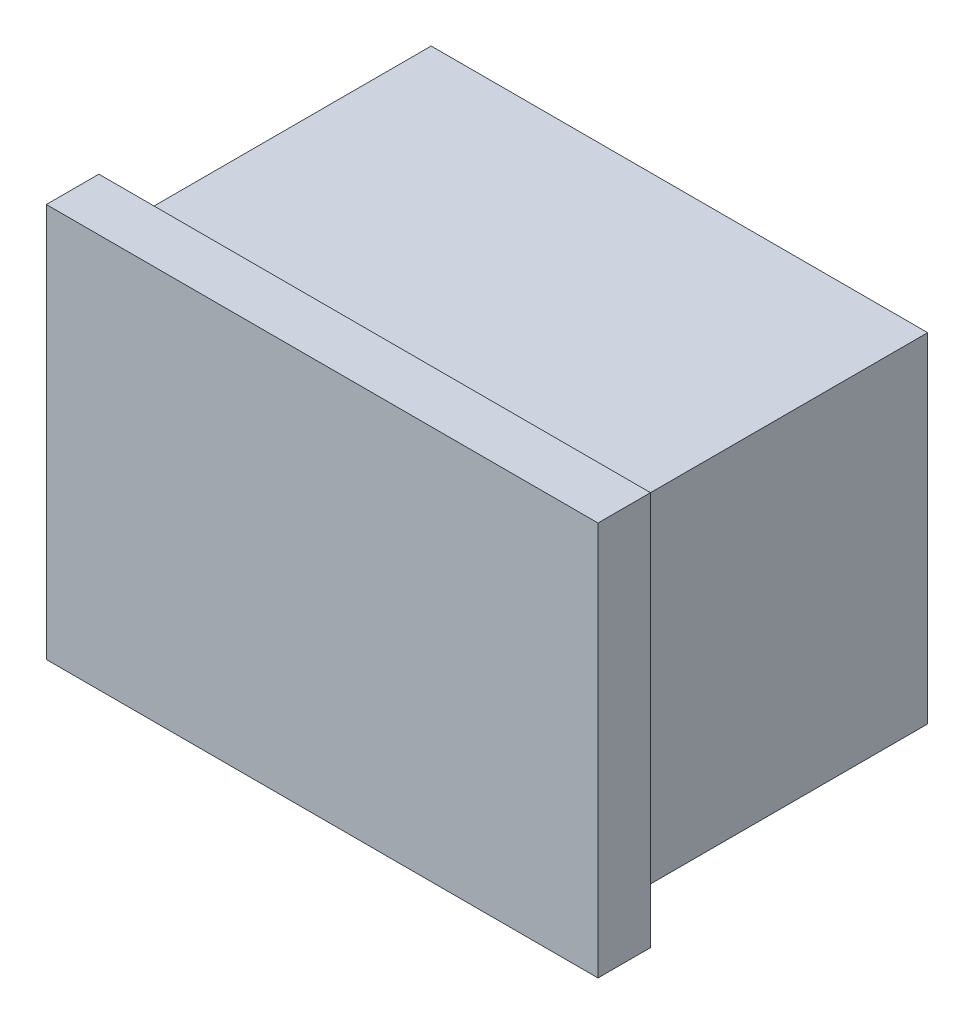
ISO-10303-21;
HEADER;
FILE_DESCRIPTION(('STEP AP214'),'2;1');
FILE_NAME('part.step','',(''),(''),'','','');
FILE_SCHEMA(('AUTOMOTIVE_DESIGN { 1 0 10303 214 1 1 1 1 }'));
ENDSEC;
DATA;
#1=APPLICATION_CONTEXT('core data for automotive mechanical design processes');
#2=APPLICATION_PROTOCOL_DEFINITION('international standard','automotive_design',2000,#1);
#3=PRODUCT_CONTEXT('',#1,'mechanical');
#4=PRODUCT('Part','Part','',(#3));
#5=PRODUCT_RELATED_PRODUCT_CATEGORY('part','',(#4));
#6=PRODUCT_DEFINITION_FORMATION('','',#4);
#7=PRODUCT_DEFINITION_CONTEXT('part definition',#1,'design');
#8=PRODUCT_DEFINITION('design','',#6,#7);
#9=PRODUCT_DEFINITION_SHAPE('','',#8);
#10=(LENGTH_UNIT() NAMED_UNIT(*) SI_UNIT(.MILLI.,.METRE.));
#11=(NAMED_UNIT(*) PLANE_ANGLE_UNIT() SI_UNIT($,.RADIAN.));
#12=(NAMED_UNIT(*) SI_UNIT($,.STERADIAN.) SOLID_ANGLE_UNIT());
#13=UNCERTAINTY_MEASURE_WITH_UNIT(LENGTH_MEASURE(1.E-05),#10,'distance_accuracy_value','');
#14=(GEOMETRIC_REPRESENTATION_CONTEXT(3) GLOBAL_UNCERTAINTY_ASSIGNED_CONTEXT((#13)) GLOBAL_UNIT_ASSIGNED_CONTEXT((#10,
#11,#12)) REPRESENTATION_CONTEXT('',''));
#15=CARTESIAN_POINT('',(0.,0.,0.));
#16=DIRECTION('',(0.,0.,1.));
#17=DIRECTION('',(1.,0.,0.));
#18=AXIS2_PLACEMENT_3D('',#15,#16,#17);
#19=CARTESIAN_POINT('',(0.,0.,11.6));
#20=DIRECTION('',(1.,0.,0.));
#21=DIRECTION('',(0.,0.,-1.));
#22=AXIS2_PLACEMENT_3D('',#19,#20,#21);
#23=PLANE('',#22);
#24=DIRECTION('',(0.,-1.,0.));
#25=VECTOR('',#24,1.);
#26=CARTESIAN_POINT('',(0.,0.,0.));
#27=LINE('',#26,#25);
#28=CARTESIAN_POINT('',(0.,12.9,0.));
#29=VERTEX_POINT('',#28);
#30=CARTESIAN_POINT('',(0.,0.,0.));
#31=VERTEX_POINT('',#30);
#32=EDGE_CURVE('E131',#29,#31,#27,.T.);
#33=ORIENTED_EDGE('',*,*,#32,.T.);
#34=DIRECTION('',(0.,0.,-1.));
#35=VECTOR('',#34,1.);
#36=CARTESIAN_POINT('',(0.,0.,11.6));
#37=LINE('',#36,#35);
#38=CARTESIAN_POINT('',(0.,0.,11.6));
#39=VERTEX_POINT('',#38);
#40=EDGE_CURVE('E11',#39,#31,#37,.T.);
#41=ORIENTED_EDGE('',*,*,#40,.F.);
#42=DIRECTION('',(0.,-1.,0.));
#43=VECTOR('',#42,1.);
#44=CARTESIAN_POINT('',(0.,0.,11.6));
#45=LINE('',#44,#43);
#46=CARTESIAN_POINT('',(0.,12.9,11.6));
#47=VERTEX_POINT('',#46);
#48=EDGE_CURVE('E140',#47,#39,#45,.T.);
#49=ORIENTED_EDGE('',*,*,#48,.F.);
#50=DIRECTION('',(0.,0.,-1.));
#51=VECTOR('',#50,1.);
#52=CARTESIAN_POINT('',(0.,12.9,11.6));
#53=LINE('',#52,#51);
#54=EDGE_CURVE('E149',#47,#29,#53,.T.);
#55=ORIENTED_EDGE('',*,*,#54,.T.);
#56=EDGE_LOOP('',(#33,#41,#49,#55));
#57=FACE_BOUND('',#56,.T.);
#58=ADVANCED_FACE('F33',(#57),#23,.F.);
#59=CARTESIAN_POINT('',(0.,0.,11.6));
#60=DIRECTION('',(0.,1.,0.));
#61=DIRECTION('',(0.,0.,1.));
#62=AXIS2_PLACEMENT_3D('',#59,#60,#61);
#63=PLANE('',#62);
#64=DIRECTION('',(1.,0.,0.));
#65=VECTOR('',#64,1.);
#66=CARTESIAN_POINT('',(0.,0.,0.));
#67=LINE('',#66,#65);
#68=CARTESIAN_POINT('',(18.9,0.,0.));
#69=VERTEX_POINT('',#68);
#70=EDGE_CURVE('E134',#31,#69,#67,.T.);
#71=ORIENTED_EDGE('',*,*,#70,.T.);
#72=DIRECTION('',(0.,0.,-1.));
#73=VECTOR('',#72,1.);
#74=CARTESIAN_POINT('',(18.9,0.,11.6));
#75=LINE('',#74,#73);
#76=CARTESIAN_POINT('',(18.9,0.,11.6));
#77=VERTEX_POINT('',#76);
#78=EDGE_CURVE('E41',#77,#69,#75,.T.);
#79=ORIENTED_EDGE('',*,*,#78,.F.);
#80=DIRECTION('',(1.,0.,0.));
#81=VECTOR('',#80,1.);
#82=CARTESIAN_POINT('',(0.,0.,11.6));
#83=LINE('',#82,#81);
#84=EDGE_CURVE('E75',#39,#77,#83,.T.);
#85=ORIENTED_EDGE('',*,*,#84,.F.);
#86=ORIENTED_EDGE('',*,*,#40,.T.);
#87=EDGE_LOOP('',(#71,#79,#85,#86));
#88=FACE_BOUND('',#87,.T.);
#89=ADVANCED_FACE('F193',(#88),#63,.F.);
#90=CARTESIAN_POINT('',(18.9,0.,11.6));
#91=DIRECTION('',(-1.,0.,0.));
#92=DIRECTION('',(0.,0.,1.));
#93=AXIS2_PLACEMENT_3D('',#90,#91,#92);
#94=PLANE('',#93);
#95=DIRECTION('',(0.,1.,0.));
#96=VECTOR('',#95,1.);
#97=CARTESIAN_POINT('',(18.9,0.,0.));
#98=LINE('',#97,#96);
#99=CARTESIAN_POINT('',(18.9,12.9,0.));
#100=VERTEX_POINT('',#99);
#101=EDGE_CURVE('E65',#69,#100,#98,.T.);
#102=ORIENTED_EDGE('',*,*,#101,.T.);
#103=DIRECTION('',(0.,0.,-1.));
#104=VECTOR('',#103,1.);
#105=CARTESIAN_POINT('',(18.9,12.9,11.6));
#106=LINE('',#105,#104);
#107=CARTESIAN_POINT('',(18.9,12.9,11.6));
#108=VERTEX_POINT('',#107);
#109=EDGE_CURVE('E49',#108,#100,#106,.T.);
#110=ORIENTED_EDGE('',*,*,#109,.F.);
#111=DIRECTION('',(0.,1.,0.));
#112=VECTOR('',#111,1.);
#113=CARTESIAN_POINT('',(18.9,0.,11.6));
#114=LINE('',#113,#112);
#115=EDGE_CURVE('E144',#77,#108,#114,.T.);
#116=ORIENTED_EDGE('',*,*,#115,.F.);
#117=ORIENTED_EDGE('',*,*,#78,.T.);
#118=EDGE_LOOP('',(#102,#110,#116,#117));
#119=FACE_BOUND('',#118,.T.);
#120=ADVANCED_FACE('F155',(#119),#94,.F.);
#121=CARTESIAN_POINT('',(0.,12.9,11.6));
#122=DIRECTION('',(0.,-1.,0.));
#123=DIRECTION('',(0.,0.,-1.));
#124=AXIS2_PLACEMENT_3D('',#121,#122,#123);
#125=PLANE('',#124);
#126=DIRECTION('',(-1.,0.,0.));
#127=VECTOR('',#126,1.);
#128=CARTESIAN_POINT('',(0.,12.9,0.));
#129=LINE('',#128,#127);
#130=EDGE_CURVE('E70',#100,#29,#129,.T.);
#131=ORIENTED_EDGE('',*,*,#130,.T.);
#132=ORIENTED_EDGE('',*,*,#54,.F.);
#133=DIRECTION('',(-1.,0.,0.));
#134=VECTOR('',#133,1.);
#135=CARTESIAN_POINT('',(0.,12.9,11.6));
#136=LINE('',#135,#134);
#137=EDGE_CURVE('E147',#108,#47,#136,.T.);
#138=ORIENTED_EDGE('',*,*,#137,.F.);
#139=ORIENTED_EDGE('',*,*,#109,.T.);
#140=EDGE_LOOP('',(#131,#132,#138,#139));
#141=FACE_BOUND('',#140,.T.);
#142=ADVANCED_FACE('F160',(#141),#125,.F.);
#143=CARTESIAN_POINT('',(0.,0.,0.));
#144=DIRECTION('',(0.,0.,-1.));
#145=DIRECTION('',(-1.,0.,0.));
#146=AXIS2_PLACEMENT_3D('',#143,#144,#145);
#147=PLANE('',#146);
#148=ORIENTED_EDGE('',*,*,#32,.F.);
#149=ORIENTED_EDGE('',*,*,#130,.F.);
#150=ORIENTED_EDGE('',*,*,#101,.F.);
#151=ORIENTED_EDGE('',*,*,#70,.F.);
#152=EDGE_LOOP('',(#148,#149,#150,#151));
#153=FACE_BOUND('',#152,.T.);
#154=ADVANCED_FACE('F158',(#153),#147,.T.);
#155=CARTESIAN_POINT('',(19.95,13.95,13.6));
#156=DIRECTION('',(-1.,0.,0.));
#157=DIRECTION('',(0.,0.,1.));
#158=AXIS2_PLACEMENT_3D('',#155,#156,#157);
#159=PLANE('',#158);
#160=DIRECTION('',(0.,1.,0.));
#161=VECTOR('',#160,1.);
#162=CARTESIAN_POINT('',(19.95,13.95,11.6));
#163=LINE('',#162,#161);
#164=CARTESIAN_POINT('',(19.95,-1.05,11.6));
#165=VERTEX_POINT('',#164);
#166=CARTESIAN_POINT('',(19.95,13.95,11.6));
#167=VERTEX_POINT('',#166);
#168=EDGE_CURVE('E130',#165,#167,#163,.T.);
#169=ORIENTED_EDGE('',*,*,#168,.T.);
#170=DIRECTION('',(0.,0.,-1.));
#171=VECTOR('',#170,1.);
#172=CARTESIAN_POINT('',(19.95,13.95,13.6));
#173=LINE('',#172,#171);
#174=CARTESIAN_POINT('',(19.95,13.95,13.6));
#175=VERTEX_POINT('',#174);
#176=EDGE_CURVE('E110',#175,#167,#173,.T.);
#177=ORIENTED_EDGE('',*,*,#176,.F.);
#178=DIRECTION('',(0.,1.,0.));
#179=VECTOR('',#178,1.);
#180=CARTESIAN_POINT('',(19.95,13.95,13.6));
#181=LINE('',#180,#179);
#182=CARTESIAN_POINT('',(19.95,-1.05,13.6));
#183=VERTEX_POINT('',#182);
#184=EDGE_CURVE('E117',#183,#175,#181,.T.);
#185=ORIENTED_EDGE('',*,*,#184,.F.);
#186=DIRECTION('',(0.,0.,-1.));
#187=VECTOR('',#186,1.);
#188=CARTESIAN_POINT('',(19.95,-1.05,13.6));
#189=LINE('',#188,#187);
#190=EDGE_CURVE('E177',#183,#165,#189,.T.);
#191=ORIENTED_EDGE('',*,*,#190,.T.);
#192=EDGE_LOOP('',(#169,#177,#185,#191));
#193=FACE_BOUND('',#192,.T.);
#194=ADVANCED_FACE('F128',(#193),#159,.F.);
#195=CARTESIAN_POINT('',(19.95,13.95,13.6));
#196=DIRECTION('',(0.,-1.,0.));
#197=DIRECTION('',(0.,0.,-1.));
#198=AXIS2_PLACEMENT_3D('',#195,#196,#197);
#199=PLANE('',#198);
#200=DIRECTION('',(-1.,0.,0.));
#201=VECTOR('',#200,1.);
#202=CARTESIAN_POINT('',(19.95,13.95,11.6));
#203=LINE('',#202,#201);
#204=CARTESIAN_POINT('',(-1.05,13.95,11.6));
#205=VERTEX_POINT('',#204);
#206=EDGE_CURVE('E168',#167,#205,#203,.T.);
#207=ORIENTED_EDGE('',*,*,#206,.T.);
#208=DIRECTION('',(0.,0.,-1.));
#209=VECTOR('',#208,1.);
#210=CARTESIAN_POINT('',(-1.05,13.95,13.6));
#211=LINE('',#210,#209);
#212=CARTESIAN_POINT('',(-1.05,13.95,13.6));
#213=VERTEX_POINT('',#212);
#214=EDGE_CURVE('E113',#213,#205,#211,.T.);
#215=ORIENTED_EDGE('',*,*,#214,.F.);
#216=DIRECTION('',(-1.,0.,0.));
#217=VECTOR('',#216,1.);
#218=CARTESIAN_POINT('',(19.95,13.95,13.6));
#219=LINE('',#218,#217);
#220=EDGE_CURVE('E106',#175,#213,#219,.T.);
#221=ORIENTED_EDGE('',*,*,#220,.F.);
#222=ORIENTED_EDGE('',*,*,#176,.T.);
#223=EDGE_LOOP('',(#207,#215,#221,#222));
#224=FACE_BOUND('',#223,.T.);
#225=ADVANCED_FACE('F108',(#224),#199,.F.);
#226=CARTESIAN_POINT('',(-1.05,13.95,13.6));
#227=DIRECTION('',(1.,0.,0.));
#228=DIRECTION('',(0.,1.,0.));
#229=AXIS2_PLACEMENT_3D('',#226,#227,#228);
#230=PLANE('',#229);
#231=DIRECTION('',(0.,-1.,0.));
#232=VECTOR('',#231,1.);
#233=CARTESIAN_POINT('',(-1.05,13.95,11.6));
#234=LINE('',#233,#232);
#235=CARTESIAN_POINT('',(-1.05,-1.05,11.6));
#236=VERTEX_POINT('',#235);
#237=EDGE_CURVE('E170',#205,#236,#234,.T.);
#238=ORIENTED_EDGE('',*,*,#237,.T.);
#239=DIRECTION('',(0.,0.,-1.));
#240=VECTOR('',#239,1.);
#241=CARTESIAN_POINT('',(-1.05,-1.05,13.6));
#242=LINE('',#241,#240);
#243=CARTESIAN_POINT('',(-1.05,-1.05,13.6));
#244=VERTEX_POINT('',#243);
#245=EDGE_CURVE('E136',#244,#236,#242,.T.);
#246=ORIENTED_EDGE('',*,*,#245,.F.);
#247=DIRECTION('',(0.,-1.,0.));
#248=VECTOR('',#247,1.);
#249=CARTESIAN_POINT('',(-1.05,13.95,13.6));
#250=LINE('',#249,#248);
#251=EDGE_CURVE('E116',#213,#244,#250,.T.);
#252=ORIENTED_EDGE('',*,*,#251,.F.);
#253=ORIENTED_EDGE('',*,*,#214,.T.);
#254=EDGE_LOOP('',(#238,#246,#252,#253));
#255=FACE_BOUND('',#254,.T.);
#256=ADVANCED_FACE('F183',(#255),#230,.F.);
#257=CARTESIAN_POINT('',(19.95,-1.05,13.6));
#258=DIRECTION('',(0.,1.,0.));
#259=DIRECTION('',(-1.,0.,0.));
#260=AXIS2_PLACEMENT_3D('',#257,#258,#259);
#261=PLANE('',#260);
#262=DIRECTION('',(1.,0.,0.));
#263=VECTOR('',#262,1.);
#264=CARTESIAN_POINT('',(19.95,-1.05,11.6));
#265=LINE('',#264,#263);
#266=EDGE_CURVE('E126',#236,#165,#265,.T.);
#267=ORIENTED_EDGE('',*,*,#266,.T.);
#268=ORIENTED_EDGE('',*,*,#190,.F.);
#269=DIRECTION('',(1.,0.,0.));
#270=VECTOR('',#269,1.);
#271=CARTESIAN_POINT('',(19.95,-1.05,13.6));
#272=LINE('',#271,#270);
#273=EDGE_CURVE('E122',#244,#183,#272,.T.);
#274=ORIENTED_EDGE('',*,*,#273,.F.);
#275=ORIENTED_EDGE('',*,*,#245,.T.);
#276=EDGE_LOOP('',(#267,#268,#274,#275));
#277=FACE_BOUND('',#276,.T.);
#278=ADVANCED_FACE('F181',(#277),#261,.F.);
#279=CARTESIAN_POINT('',(0.,0.,13.6));
#280=DIRECTION('',(0.,0.,-1.));
#281=DIRECTION('',(-1.,0.,0.));
#282=AXIS2_PLACEMENT_3D('',#279,#280,#281);
#283=PLANE('',#282);
#284=ORIENTED_EDGE('',*,*,#184,.T.);
#285=ORIENTED_EDGE('',*,*,#220,.T.);
#286=ORIENTED_EDGE('',*,*,#251,.T.);
#287=ORIENTED_EDGE('',*,*,#273,.T.);
#288=EDGE_LOOP('',(#284,#285,#286,#287));
#289=FACE_BOUND('',#288,.T.);
#290=ADVANCED_FACE('F120',(#289),#283,.F.);
#291=CARTESIAN_POINT('',(0.,0.,11.6));
#292=DIRECTION('',(0.,0.,-1.));
#293=DIRECTION('',(-1.,0.,0.));
#294=AXIS2_PLACEMENT_3D('',#291,#292,#293);
#295=PLANE('',#294);
#296=ORIENTED_EDGE('',*,*,#137,.T.);
#297=ORIENTED_EDGE('',*,*,#48,.T.);
#298=ORIENTED_EDGE('',*,*,#84,.T.);
#299=ORIENTED_EDGE('',*,*,#115,.T.);
#300=EDGE_LOOP('',(#296,#297,#298,#299));
#301=FACE_BOUND('',#300,.T.);
#302=ORIENTED_EDGE('',*,*,#168,.F.);
#303=ORIENTED_EDGE('',*,*,#266,.F.);
#304=ORIENTED_EDGE('',*,*,#237,.F.);
#305=ORIENTED_EDGE('',*,*,#206,.F.);
#306=EDGE_LOOP('',(#302,#303,#304,#305));
#307=FACE_BOUND('',#306,.T.);
#308=ADVANCED_FACE('F162',(#301,#307),#295,.T.);
#309=CLOSED_SHELL('',(#58,#89,#120,#142,#154,#194,#225,#256,#278,#290,#308));
#310=MANIFOLD_SOLID_BREP('B2',#309);
#311=ADVANCED_BREP_SHAPE_REPRESENTATION('',(#18,#310),#14);
#312=SHAPE_DEFINITION_REPRESENTATION(#9,#311);
ENDSEC;
END-ISO-10303-21;
